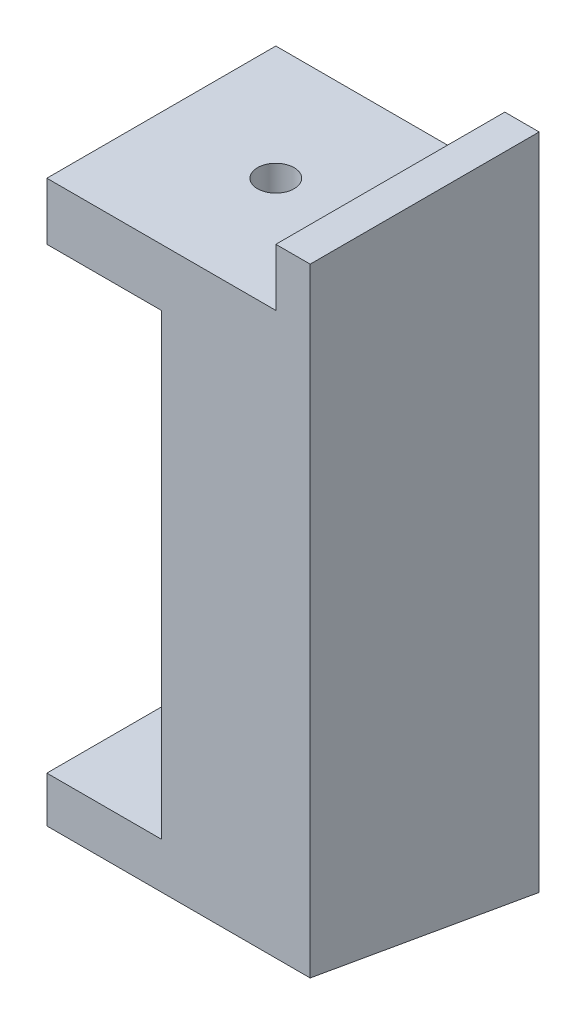
ISO-10303-21;
HEADER;
FILE_DESCRIPTION(('STEP AP214'),'2;1');
FILE_NAME('part.step','',(''),(''),'','','');
FILE_SCHEMA(('AUTOMOTIVE_DESIGN { 1 0 10303 214 1 1 1 1 }'));
ENDSEC;
DATA;
#1=APPLICATION_CONTEXT('core data for automotive mechanical design processes');
#2=APPLICATION_PROTOCOL_DEFINITION('international standard','automotive_design',2000,#1);
#3=PRODUCT_CONTEXT('',#1,'mechanical');
#4=PRODUCT('Part','Part','',(#3));
#5=PRODUCT_RELATED_PRODUCT_CATEGORY('part','',(#4));
#6=PRODUCT_DEFINITION_FORMATION('','',#4);
#7=PRODUCT_DEFINITION_CONTEXT('part definition',#1,'design');
#8=PRODUCT_DEFINITION('design','',#6,#7);
#9=PRODUCT_DEFINITION_SHAPE('','',#8);
#10=(LENGTH_UNIT() NAMED_UNIT(*) SI_UNIT(.MILLI.,.METRE.));
#11=(NAMED_UNIT(*) PLANE_ANGLE_UNIT() SI_UNIT($,.RADIAN.));
#12=(NAMED_UNIT(*) SI_UNIT($,.STERADIAN.) SOLID_ANGLE_UNIT());
#13=UNCERTAINTY_MEASURE_WITH_UNIT(LENGTH_MEASURE(1.E-05),#10,'distance_accuracy_value','');
#14=(GEOMETRIC_REPRESENTATION_CONTEXT(3) GLOBAL_UNCERTAINTY_ASSIGNED_CONTEXT((#13)) GLOBAL_UNIT_ASSIGNED_CONTEXT((#10,
#11,#12)) REPRESENTATION_CONTEXT('',''));
#15=CARTESIAN_POINT('',(0.,0.,0.));
#16=DIRECTION('',(0.,0.,1.));
#17=DIRECTION('',(1.,0.,0.));
#18=AXIS2_PLACEMENT_3D('',#15,#16,#17);
#19=CARTESIAN_POINT('',(-10.,-2.5,20.));
#20=DIRECTION('',(0.,1.,0.));
#21=DIRECTION('',(0.,0.,1.));
#22=AXIS2_PLACEMENT_3D('',#19,#20,#21);
#23=PLANE('',#22);
#24=CARTESIAN_POINT('',(0.,-2.5,10.));
#25=DIRECTION('',(0.,1.,0.));
#26=DIRECTION('',(0.,0.,1.));
#27=AXIS2_PLACEMENT_3D('',#24,#25,#26);
#28=CIRCLE('',#27,1.6);
#29=CARTESIAN_POINT('',(0.,-2.5,11.6));
#30=VERTEX_POINT('',#29);
#31=EDGE_CURVE('E231',#30,#30,#28,.T.);
#32=ORIENTED_EDGE('',*,*,#31,.T.);
#33=EDGE_LOOP('',(#32));
#34=FACE_BOUND('',#33,.T.);
#35=DIRECTION('',(-1.,0.,0.));
#36=VECTOR('',#35,1.);
#37=CARTESIAN_POINT('',(8.,-2.5,3.));
#38=LINE('',#37,#36);
#39=CARTESIAN_POINT('',(6.,-2.5,3.));
#40=VERTEX_POINT('',#39);
#41=CARTESIAN_POINT('',(0.,-2.5,3.));
#42=VERTEX_POINT('',#41);
#43=EDGE_CURVE('E215',#40,#42,#38,.T.);
#44=ORIENTED_EDGE('',*,*,#43,.F.);
#45=CARTESIAN_POINT('',(6.,-2.5,5.));
#46=DIRECTION('',(0.,1.,0.));
#47=DIRECTION('',(0.,0.,1.));
#48=AXIS2_PLACEMENT_3D('',#45,#46,#47);
#49=CIRCLE('',#48,2.);
#50=CARTESIAN_POINT('',(8.,-2.5,5.));
#51=VERTEX_POINT('',#50);
#52=EDGE_CURVE('E279',#40,#51,#49,.F.);
#53=ORIENTED_EDGE('',*,*,#52,.T.);
#54=DIRECTION('',(0.,0.,-1.));
#55=VECTOR('',#54,1.);
#56=CARTESIAN_POINT('',(8.,-2.5,3.));
#57=LINE('',#56,#55);
#58=CARTESIAN_POINT('',(8.,-2.5,15.));
#59=VERTEX_POINT('',#58);
#60=EDGE_CURVE('E213',#59,#51,#57,.T.);
#61=ORIENTED_EDGE('',*,*,#60,.F.);
#62=CARTESIAN_POINT('',(6.,-2.5,15.));
#63=DIRECTION('',(0.,1.,0.));
#64=DIRECTION('',(0.,0.,1.));
#65=AXIS2_PLACEMENT_3D('',#62,#63,#64);
#66=CIRCLE('',#65,2.);
#67=CARTESIAN_POINT('',(6.,-2.5,17.));
#68=VERTEX_POINT('',#67);
#69=EDGE_CURVE('E277',#59,#68,#66,.F.);
#70=ORIENTED_EDGE('',*,*,#69,.T.);
#71=DIRECTION('',(1.,0.,0.));
#72=VECTOR('',#71,1.);
#73=CARTESIAN_POINT('',(8.,-2.5,17.));
#74=LINE('',#73,#72);
#75=CARTESIAN_POINT('',(0.,-2.5,17.));
#76=VERTEX_POINT('',#75);
#77=EDGE_CURVE('E211',#76,#68,#74,.T.);
#78=ORIENTED_EDGE('',*,*,#77,.F.);
#79=DIRECTION('',(0.,0.,-1.));
#80=VECTOR('',#79,1.);
#81=CARTESIAN_POINT('',(0.,-2.5,20.));
#82=LINE('',#81,#80);
#83=CARTESIAN_POINT('',(0.,-2.5,20.));
#84=VERTEX_POINT('',#83);
#85=EDGE_CURVE('E189',#84,#76,#82,.T.);
#86=ORIENTED_EDGE('',*,*,#85,.F.);
#87=DIRECTION('',(1.,0.,0.));
#88=VECTOR('',#87,1.);
#89=CARTESIAN_POINT('',(10.,-2.5,20.));
#90=LINE('',#89,#88);
#91=CARTESIAN_POINT('',(-10.,-2.5,20.));
#92=VERTEX_POINT('',#91);
#93=EDGE_CURVE('E232',#92,#84,#90,.T.);
#94=ORIENTED_EDGE('',*,*,#93,.F.);
#95=DIRECTION('',(0.,0.,-1.));
#96=VECTOR('',#95,1.);
#97=CARTESIAN_POINT('',(-10.,-2.5,20.));
#98=LINE('',#97,#96);
#99=CARTESIAN_POINT('',(-10.,-2.5,0.));
#100=VERTEX_POINT('',#99);
#101=EDGE_CURVE('E246',#92,#100,#98,.T.);
#102=ORIENTED_EDGE('',*,*,#101,.T.);
#103=DIRECTION('',(1.,0.,0.));
#104=VECTOR('',#103,1.);
#105=CARTESIAN_POINT('',(-10.,-2.5,0.));
#106=LINE('',#105,#104);
#107=CARTESIAN_POINT('',(0.,-2.5,0.));
#108=VERTEX_POINT('',#107);
#109=EDGE_CURVE('E235',#100,#108,#106,.T.);
#110=ORIENTED_EDGE('',*,*,#109,.T.);
#111=DIRECTION('',(0.,0.,-1.));
#112=VECTOR('',#111,1.);
#113=CARTESIAN_POINT('',(0.,-2.5,0.));
#114=LINE('',#113,#112);
#115=EDGE_CURVE('E197',#42,#108,#114,.T.);
#116=ORIENTED_EDGE('',*,*,#115,.F.);
#117=EDGE_LOOP('',(#44,#53,#61,#70,#78,#86,#94,#102,#110,#116));
#118=FACE_BOUND('',#117,.T.);
#119=ADVANCED_FACE('F33',(#34,#118),#23,.F.);
#120=CARTESIAN_POINT('',(13.,-2.5,20.));
#121=DIRECTION('',(-1.,0.,0.));
#122=DIRECTION('',(0.,-1.,0.));
#123=AXIS2_PLACEMENT_3D('',#120,#121,#122);
#124=PLANE('',#123);
#125=DIRECTION('',(0.,1.,0.));
#126=VECTOR('',#125,1.);
#127=CARTESIAN_POINT('',(13.,-2.5,0.));
#128=LINE('',#127,#126);
#129=CARTESIAN_POINT('',(13.,-50.0265396141692,0.));
#130=VERTEX_POINT('',#129);
#131=CARTESIAN_POINT('',(13.,7.5,0.));
#132=VERTEX_POINT('',#131);
#133=EDGE_CURVE('E247',#130,#132,#128,.T.);
#134=ORIENTED_EDGE('',*,*,#133,.T.);
#135=DIRECTION('',(0.,0.,-1.));
#136=VECTOR('',#135,1.);
#137=CARTESIAN_POINT('',(13.,7.5,20.));
#138=LINE('',#137,#136);
#139=CARTESIAN_POINT('',(13.,7.5,20.));
#140=VERTEX_POINT('',#139);
#141=EDGE_CURVE('E269',#140,#132,#138,.T.);
#142=ORIENTED_EDGE('',*,*,#141,.F.);
#143=DIRECTION('',(0.,1.,0.));
#144=VECTOR('',#143,1.);
#145=CARTESIAN_POINT('',(13.,-2.5,20.));
#146=LINE('',#145,#144);
#147=CARTESIAN_POINT('',(13.,-46.5,20.));
#148=VERTEX_POINT('',#147);
#149=EDGE_CURVE('E234',#148,#140,#146,.T.);
#150=ORIENTED_EDGE('',*,*,#149,.F.);
#151=DIRECTION('',(0.,-0.173648177666926,-0.984807753012209));
#152=VECTOR('',#151,1.);
#153=CARTESIAN_POINT('',(13.,-46.5,20.));
#154=LINE('',#153,#152);
#155=EDGE_CURVE('E179',#148,#130,#154,.T.);
#156=ORIENTED_EDGE('',*,*,#155,.T.);
#157=EDGE_LOOP('',(#134,#142,#150,#156));
#158=FACE_BOUND('',#157,.T.);
#159=ADVANCED_FACE('F310',(#158),#124,.F.);
#160=CARTESIAN_POINT('',(10.,7.5,20.));
#161=DIRECTION('',(0.,-1.,0.));
#162=DIRECTION('',(0.,0.,-1.));
#163=AXIS2_PLACEMENT_3D('',#160,#161,#162);
#164=PLANE('',#163);
#165=DIRECTION('',(-1.,0.,0.));
#166=VECTOR('',#165,1.);
#167=CARTESIAN_POINT('',(10.,7.5,0.));
#168=LINE('',#167,#166);
#169=CARTESIAN_POINT('',(10.,7.5,0.));
#170=VERTEX_POINT('',#169);
#171=EDGE_CURVE('E249',#132,#170,#168,.T.);
#172=ORIENTED_EDGE('',*,*,#171,.T.);
#173=DIRECTION('',(0.,0.,-1.));
#174=VECTOR('',#173,1.);
#175=CARTESIAN_POINT('',(10.,7.5,20.));
#176=LINE('',#175,#174);
#177=CARTESIAN_POINT('',(10.,7.5,20.));
#178=VERTEX_POINT('',#177);
#179=EDGE_CURVE('E266',#178,#170,#176,.T.);
#180=ORIENTED_EDGE('',*,*,#179,.F.);
#181=DIRECTION('',(-1.,0.,0.));
#182=VECTOR('',#181,1.);
#183=CARTESIAN_POINT('',(10.,7.5,20.));
#184=LINE('',#183,#182);
#185=EDGE_CURVE('E237',#140,#178,#184,.T.);
#186=ORIENTED_EDGE('',*,*,#185,.F.);
#187=ORIENTED_EDGE('',*,*,#141,.T.);
#188=EDGE_LOOP('',(#172,#180,#186,#187));
#189=FACE_BOUND('',#188,.T.);
#190=ADVANCED_FACE('F312',(#189),#164,.F.);
#191=CARTESIAN_POINT('',(10.,2.5,20.));
#192=DIRECTION('',(1.,0.,0.));
#193=DIRECTION('',(0.,1.,0.));
#194=AXIS2_PLACEMENT_3D('',#191,#192,#193);
#195=PLANE('',#194);
#196=DIRECTION('',(0.,-1.,0.));
#197=VECTOR('',#196,1.);
#198=CARTESIAN_POINT('',(10.,2.5,0.));
#199=LINE('',#198,#197);
#200=CARTESIAN_POINT('',(10.,2.5,0.));
#201=VERTEX_POINT('',#200);
#202=EDGE_CURVE('E251',#170,#201,#199,.T.);
#203=ORIENTED_EDGE('',*,*,#202,.T.);
#204=DIRECTION('',(0.,0.,-1.));
#205=VECTOR('',#204,1.);
#206=CARTESIAN_POINT('',(10.,2.5,20.));
#207=LINE('',#206,#205);
#208=CARTESIAN_POINT('',(10.,2.5,20.));
#209=VERTEX_POINT('',#208);
#210=EDGE_CURVE('E263',#209,#201,#207,.T.);
#211=ORIENTED_EDGE('',*,*,#210,.F.);
#212=DIRECTION('',(0.,-1.,0.));
#213=VECTOR('',#212,1.);
#214=CARTESIAN_POINT('',(10.,2.5,20.));
#215=LINE('',#214,#213);
#216=EDGE_CURVE('E239',#178,#209,#215,.T.);
#217=ORIENTED_EDGE('',*,*,#216,.F.);
#218=ORIENTED_EDGE('',*,*,#179,.T.);
#219=EDGE_LOOP('',(#203,#211,#217,#218));
#220=FACE_BOUND('',#219,.T.);
#221=ADVANCED_FACE('F317',(#220),#195,.F.);
#222=CARTESIAN_POINT('',(-10.,2.5,20.));
#223=DIRECTION('',(0.,-1.,0.));
#224=DIRECTION('',(0.,0.,-1.));
#225=AXIS2_PLACEMENT_3D('',#222,#223,#224);
#226=PLANE('',#225);
#227=CARTESIAN_POINT('',(0.,2.5,10.));
#228=DIRECTION('',(0.,1.,0.));
#229=DIRECTION('',(0.,0.,1.));
#230=AXIS2_PLACEMENT_3D('',#227,#228,#229);
#231=CIRCLE('',#230,1.6);
#232=CARTESIAN_POINT('',(0.,2.5,11.6));
#233=VERTEX_POINT('',#232);
#234=EDGE_CURVE('E228',#233,#233,#231,.T.);
#235=ORIENTED_EDGE('',*,*,#234,.F.);
#236=EDGE_LOOP('',(#235));
#237=FACE_BOUND('',#236,.T.);
#238=DIRECTION('',(-1.,0.,0.));
#239=VECTOR('',#238,1.);
#240=CARTESIAN_POINT('',(-10.,2.5,0.));
#241=LINE('',#240,#239);
#242=CARTESIAN_POINT('',(-10.,2.5,0.));
#243=VERTEX_POINT('',#242);
#244=EDGE_CURVE('E253',#201,#243,#241,.T.);
#245=ORIENTED_EDGE('',*,*,#244,.T.);
#246=DIRECTION('',(0.,0.,-1.));
#247=VECTOR('',#246,1.);
#248=CARTESIAN_POINT('',(-10.,2.5,20.));
#249=LINE('',#248,#247);
#250=CARTESIAN_POINT('',(-10.,2.5,20.));
#251=VERTEX_POINT('',#250);
#252=EDGE_CURVE('E260',#251,#243,#249,.T.);
#253=ORIENTED_EDGE('',*,*,#252,.F.);
#254=DIRECTION('',(-1.,0.,0.));
#255=VECTOR('',#254,1.);
#256=CARTESIAN_POINT('',(-10.,2.5,20.));
#257=LINE('',#256,#255);
#258=EDGE_CURVE('E241',#209,#251,#257,.T.);
#259=ORIENTED_EDGE('',*,*,#258,.F.);
#260=ORIENTED_EDGE('',*,*,#210,.T.);
#261=EDGE_LOOP('',(#245,#253,#259,#260));
#262=FACE_BOUND('',#261,.T.);
#263=ADVANCED_FACE('F323',(#237,#262),#226,.F.);
#264=CARTESIAN_POINT('',(-10.,2.5,20.));
#265=DIRECTION('',(1.,0.,0.));
#266=DIRECTION('',(0.,0.,-1.));
#267=AXIS2_PLACEMENT_3D('',#264,#265,#266);
#268=PLANE('',#267);
#269=DIRECTION('',(0.,-1.,0.));
#270=VECTOR('',#269,1.);
#271=CARTESIAN_POINT('',(-10.,2.5,0.));
#272=LINE('',#271,#270);
#273=EDGE_CURVE('E255',#243,#100,#272,.T.);
#274=ORIENTED_EDGE('',*,*,#273,.T.);
#275=ORIENTED_EDGE('',*,*,#101,.F.);
#276=DIRECTION('',(0.,-1.,0.));
#277=VECTOR('',#276,1.);
#278=CARTESIAN_POINT('',(-10.,2.5,20.));
#279=LINE('',#278,#277);
#280=EDGE_CURVE('E243',#251,#92,#279,.T.);
#281=ORIENTED_EDGE('',*,*,#280,.F.);
#282=ORIENTED_EDGE('',*,*,#252,.T.);
#283=EDGE_LOOP('',(#274,#275,#281,#282));
#284=FACE_BOUND('',#283,.T.);
#285=ADVANCED_FACE('F327',(#284),#268,.F.);
#286=CARTESIAN_POINT('',(0.,0.,20.));
#287=DIRECTION('',(0.,0.,1.));
#288=DIRECTION('',(1.,0.,0.));
#289=AXIS2_PLACEMENT_3D('',#286,#287,#288);
#290=PLANE('',#289);
#291=ORIENTED_EDGE('',*,*,#93,.T.);
#292=DIRECTION('',(0.,1.,0.));
#293=VECTOR('',#292,1.);
#294=CARTESIAN_POINT('',(0.,-42.5,20.));
#295=LINE('',#294,#293);
#296=CARTESIAN_POINT('',(0.,-42.5,20.));
#297=VERTEX_POINT('',#296);
#298=EDGE_CURVE('E157',#297,#84,#295,.T.);
#299=ORIENTED_EDGE('',*,*,#298,.F.);
#300=DIRECTION('',(1.,0.,0.));
#301=VECTOR('',#300,1.);
#302=CARTESIAN_POINT('',(-9.99999999999998,-42.5,20.));
#303=LINE('',#302,#301);
#304=CARTESIAN_POINT('',(-9.99999999999998,-42.5,20.));
#305=VERTEX_POINT('',#304);
#306=EDGE_CURVE('E150',#305,#297,#303,.T.);
#307=ORIENTED_EDGE('',*,*,#306,.F.);
#308=DIRECTION('',(0.,-1.,0.));
#309=VECTOR('',#308,1.);
#310=CARTESIAN_POINT('',(-9.99999999999998,-42.5,20.));
#311=LINE('',#310,#309);
#312=CARTESIAN_POINT('',(-9.99999999999998,-46.5,20.));
#313=VERTEX_POINT('',#312);
#314=EDGE_CURVE('E155',#305,#313,#311,.T.);
#315=ORIENTED_EDGE('',*,*,#314,.T.);
#316=DIRECTION('',(1.,0.,0.));
#317=VECTOR('',#316,1.);
#318=CARTESIAN_POINT('',(-9.99999999999998,-46.5,20.));
#319=LINE('',#318,#317);
#320=EDGE_CURVE('E162',#313,#148,#319,.T.);
#321=ORIENTED_EDGE('',*,*,#320,.T.);
#322=ORIENTED_EDGE('',*,*,#149,.T.);
#323=ORIENTED_EDGE('',*,*,#185,.T.);
#324=ORIENTED_EDGE('',*,*,#216,.T.);
#325=ORIENTED_EDGE('',*,*,#258,.T.);
#326=ORIENTED_EDGE('',*,*,#280,.T.);
#327=EDGE_LOOP('',(#291,#299,#307,#315,#321,#322,#323,#324,#325,#326));
#328=FACE_BOUND('',#327,.T.);
#329=ADVANCED_FACE('F153',(#328),#290,.T.);
#330=CARTESIAN_POINT('',(0.,0.,0.));
#331=DIRECTION('',(0.,0.,1.));
#332=DIRECTION('',(1.,0.,0.));
#333=AXIS2_PLACEMENT_3D('',#330,#331,#332);
#334=PLANE('',#333);
#335=ORIENTED_EDGE('',*,*,#133,.F.);
#336=DIRECTION('',(1.,0.,0.));
#337=VECTOR('',#336,1.);
#338=CARTESIAN_POINT('',(-9.99999999999998,-50.0265396141692,0.));
#339=LINE('',#338,#337);
#340=CARTESIAN_POINT('',(-9.99999999999998,-50.0265396141692,0.));
#341=VERTEX_POINT('',#340);
#342=EDGE_CURVE('E190',#341,#130,#339,.T.);
#343=ORIENTED_EDGE('',*,*,#342,.F.);
#344=DIRECTION('',(0.,1.,0.));
#345=VECTOR('',#344,1.);
#346=CARTESIAN_POINT('',(-9.99999999999998,-50.0265396141692,0.));
#347=LINE('',#346,#345);
#348=CARTESIAN_POINT('',(-9.99999999999998,-42.5,0.));
#349=VERTEX_POINT('',#348);
#350=EDGE_CURVE('E163',#341,#349,#347,.T.);
#351=ORIENTED_EDGE('',*,*,#350,.T.);
#352=DIRECTION('',(1.,0.,0.));
#353=VECTOR('',#352,1.);
#354=CARTESIAN_POINT('',(-9.99999999999998,-42.5,0.));
#355=LINE('',#354,#353);
#356=CARTESIAN_POINT('',(0.,-42.5,0.));
#357=VERTEX_POINT('',#356);
#358=EDGE_CURVE('E178',#349,#357,#355,.T.);
#359=ORIENTED_EDGE('',*,*,#358,.T.);
#360=DIRECTION('',(0.,1.,0.));
#361=VECTOR('',#360,1.);
#362=CARTESIAN_POINT('',(0.,-42.5,0.));
#363=LINE('',#362,#361);
#364=EDGE_CURVE('E208',#357,#108,#363,.T.);
#365=ORIENTED_EDGE('',*,*,#364,.T.);
#366=ORIENTED_EDGE('',*,*,#109,.F.);
#367=ORIENTED_EDGE('',*,*,#273,.F.);
#368=ORIENTED_EDGE('',*,*,#244,.F.);
#369=ORIENTED_EDGE('',*,*,#202,.F.);
#370=ORIENTED_EDGE('',*,*,#171,.F.);
#371=EDGE_LOOP('',(#335,#343,#351,#359,#365,#366,#367,#368,#369,#370));
#372=FACE_BOUND('',#371,.T.);
#373=ADVANCED_FACE('F301',(#372),#334,.F.);
#374=CARTESIAN_POINT('',(0.,-17.5,10.));
#375=DIRECTION('',(0.,1.,0.));
#376=DIRECTION('',(0.,0.,1.));
#377=AXIS2_PLACEMENT_3D('',#374,#375,#376);
#378=CYLINDRICAL_SURFACE('',#377,1.6);
#379=ORIENTED_EDGE('',*,*,#234,.T.);
#380=EDGE_LOOP('',(#379));
#381=FACE_BOUND('',#380,.T.);
#382=ORIENTED_EDGE('',*,*,#31,.F.);
#383=EDGE_LOOP('',(#382));
#384=FACE_BOUND('',#383,.T.);
#385=ADVANCED_FACE('F437',(#381,#384),#378,.F.);
#386=CARTESIAN_POINT('',(0.,-42.5,20.));
#387=DIRECTION('',(1.,0.,0.));
#388=DIRECTION('',(0.,0.,-1.));
#389=AXIS2_PLACEMENT_3D('',#386,#387,#388);
#390=PLANE('',#389);
#391=ORIENTED_EDGE('',*,*,#85,.T.);
#392=DIRECTION('',(0.,1.,0.));
#393=VECTOR('',#392,1.);
#394=CARTESIAN_POINT('',(0.,-42.5,17.));
#395=LINE('',#394,#393);
#396=CARTESIAN_POINT('',(0.,-42.5,17.));
#397=VERTEX_POINT('',#396);
#398=EDGE_CURVE('E224',#397,#76,#395,.T.);
#399=ORIENTED_EDGE('',*,*,#398,.F.);
#400=DIRECTION('',(0.,0.,-1.));
#401=VECTOR('',#400,1.);
#402=CARTESIAN_POINT('',(0.,-42.5,20.));
#403=LINE('',#402,#401);
#404=EDGE_CURVE('E194',#297,#397,#403,.T.);
#405=ORIENTED_EDGE('',*,*,#404,.F.);
#406=ORIENTED_EDGE('',*,*,#298,.T.);
#407=EDGE_LOOP('',(#391,#399,#405,#406));
#408=FACE_BOUND('',#407,.T.);
#409=ADVANCED_FACE('F329',(#408),#390,.F.);
#410=CARTESIAN_POINT('',(8.,-42.5,17.));
#411=DIRECTION('',(0.,0.,1.));
#412=DIRECTION('',(1.,0.,0.));
#413=AXIS2_PLACEMENT_3D('',#410,#411,#412);
#414=PLANE('',#413);
#415=ORIENTED_EDGE('',*,*,#77,.T.);
#416=DIRECTION('',(0.,1.,0.));
#417=VECTOR('',#416,1.);
#418=CARTESIAN_POINT('',(6.,-42.5,17.));
#419=LINE('',#418,#417);
#420=CARTESIAN_POINT('',(6.,-42.5,17.));
#421=VERTEX_POINT('',#420);
#422=EDGE_CURVE('E49',#68,#421,#419,.F.);
#423=ORIENTED_EDGE('',*,*,#422,.T.);
#424=DIRECTION('',(1.,0.,0.));
#425=VECTOR('',#424,1.);
#426=CARTESIAN_POINT('',(8.,-42.5,17.));
#427=LINE('',#426,#425);
#428=EDGE_CURVE('E196',#397,#421,#427,.T.);
#429=ORIENTED_EDGE('',*,*,#428,.F.);
#430=ORIENTED_EDGE('',*,*,#398,.T.);
#431=EDGE_LOOP('',(#415,#423,#429,#430));
#432=FACE_BOUND('',#431,.T.);
#433=ADVANCED_FACE('F330',(#432),#414,.F.);
#434=CARTESIAN_POINT('',(8.,-42.5,3.));
#435=DIRECTION('',(1.,0.,0.));
#436=DIRECTION('',(0.,0.,-1.));
#437=AXIS2_PLACEMENT_3D('',#434,#435,#436);
#438=PLANE('',#437);
#439=ORIENTED_EDGE('',*,*,#60,.T.);
#440=DIRECTION('',(0.,1.,0.));
#441=VECTOR('',#440,1.);
#442=CARTESIAN_POINT('',(8.,-42.5,5.));
#443=LINE('',#442,#441);
#444=CARTESIAN_POINT('',(8.,-42.5,5.));
#445=VERTEX_POINT('',#444);
#446=EDGE_CURVE('E57',#51,#445,#443,.F.);
#447=ORIENTED_EDGE('',*,*,#446,.T.);
#448=DIRECTION('',(0.,0.,-1.));
#449=VECTOR('',#448,1.);
#450=CARTESIAN_POINT('',(8.,-42.5,3.));
#451=LINE('',#450,#449);
#452=CARTESIAN_POINT('',(8.,-42.5,15.));
#453=VERTEX_POINT('',#452);
#454=EDGE_CURVE('E200',#453,#445,#451,.T.);
#455=ORIENTED_EDGE('',*,*,#454,.F.);
#456=DIRECTION('',(0.,1.,0.));
#457=VECTOR('',#456,1.);
#458=CARTESIAN_POINT('',(8.,-2.5,15.));
#459=LINE('',#458,#457);
#460=EDGE_CURVE('E281',#453,#59,#459,.T.);
#461=ORIENTED_EDGE('',*,*,#460,.T.);
#462=EDGE_LOOP('',(#439,#447,#455,#461));
#463=FACE_BOUND('',#462,.T.);
#464=ADVANCED_FACE('F333',(#463),#438,.F.);
#465=CARTESIAN_POINT('',(8.,-42.5,3.));
#466=DIRECTION('',(0.,0.,-1.));
#467=DIRECTION('',(-1.,0.,0.));
#468=AXIS2_PLACEMENT_3D('',#465,#466,#467);
#469=PLANE('',#468);
#470=DIRECTION('',(-1.,0.,0.));
#471=VECTOR('',#470,1.);
#472=CARTESIAN_POINT('',(8.,-42.5,3.));
#473=LINE('',#472,#471);
#474=CARTESIAN_POINT('',(6.,-42.5,3.));
#475=VERTEX_POINT('',#474);
#476=CARTESIAN_POINT('',(0.,-42.5,3.));
#477=VERTEX_POINT('',#476);
#478=EDGE_CURVE('E203',#475,#477,#473,.T.);
#479=ORIENTED_EDGE('',*,*,#478,.F.);
#480=DIRECTION('',(0.,1.,0.));
#481=VECTOR('',#480,1.);
#482=CARTESIAN_POINT('',(6.,-2.5,3.));
#483=LINE('',#482,#481);
#484=EDGE_CURVE('E272',#475,#40,#483,.T.);
#485=ORIENTED_EDGE('',*,*,#484,.T.);
#486=ORIENTED_EDGE('',*,*,#43,.T.);
#487=DIRECTION('',(0.,1.,0.));
#488=VECTOR('',#487,1.);
#489=CARTESIAN_POINT('',(0.,-42.5,3.));
#490=LINE('',#489,#488);
#491=EDGE_CURVE('E221',#477,#42,#490,.T.);
#492=ORIENTED_EDGE('',*,*,#491,.F.);
#493=EDGE_LOOP('',(#479,#485,#486,#492));
#494=FACE_BOUND('',#493,.T.);
#495=ADVANCED_FACE('F292',(#494),#469,.F.);
#496=CARTESIAN_POINT('',(0.,-42.5,0.));
#497=DIRECTION('',(1.,0.,0.));
#498=DIRECTION('',(0.,0.,-1.));
#499=AXIS2_PLACEMENT_3D('',#496,#497,#498);
#500=PLANE('',#499);
#501=ORIENTED_EDGE('',*,*,#115,.T.);
#502=ORIENTED_EDGE('',*,*,#364,.F.);
#503=DIRECTION('',(0.,0.,-1.));
#504=VECTOR('',#503,1.);
#505=CARTESIAN_POINT('',(0.,-42.5,0.));
#506=LINE('',#505,#504);
#507=EDGE_CURVE('E206',#477,#357,#506,.T.);
#508=ORIENTED_EDGE('',*,*,#507,.F.);
#509=ORIENTED_EDGE('',*,*,#491,.T.);
#510=EDGE_LOOP('',(#501,#502,#508,#509));
#511=FACE_BOUND('',#510,.T.);
#512=ADVANCED_FACE('F299',(#511),#500,.F.);
#513=CARTESIAN_POINT('',(6.,-42.5,5.));
#514=DIRECTION('',(0.,-1.,0.));
#515=DIRECTION('',(0.,0.,-1.));
#516=AXIS2_PLACEMENT_3D('',#513,#514,#515);
#517=CYLINDRICAL_SURFACE('',#516,2.);
#518=CARTESIAN_POINT('',(6.,-42.5,5.));
#519=DIRECTION('',(0.,-1.,0.));
#520=DIRECTION('',(0.,0.,-1.));
#521=AXIS2_PLACEMENT_3D('',#518,#519,#520);
#522=CIRCLE('',#521,2.);
#523=EDGE_CURVE('E42',#445,#475,#522,.F.);
#524=ORIENTED_EDGE('',*,*,#523,.F.);
#525=ORIENTED_EDGE('',*,*,#446,.F.);
#526=ORIENTED_EDGE('',*,*,#52,.F.);
#527=ORIENTED_EDGE('',*,*,#484,.F.);
#528=EDGE_LOOP('',(#524,#525,#526,#527));
#529=FACE_BOUND('',#528,.T.);
#530=ADVANCED_FACE('F289',(#529),#517,.F.);
#531=CARTESIAN_POINT('',(6.,-42.5,15.));
#532=DIRECTION('',(0.,-1.,0.));
#533=DIRECTION('',(0.,0.,-1.));
#534=AXIS2_PLACEMENT_3D('',#531,#532,#533);
#535=CYLINDRICAL_SURFACE('',#534,2.);
#536=CARTESIAN_POINT('',(6.,-42.5,15.));
#537=DIRECTION('',(0.,-1.,0.));
#538=DIRECTION('',(0.,0.,-1.));
#539=AXIS2_PLACEMENT_3D('',#536,#537,#538);
#540=CIRCLE('',#539,2.);
#541=EDGE_CURVE('E11',#421,#453,#540,.F.);
#542=ORIENTED_EDGE('',*,*,#541,.F.);
#543=ORIENTED_EDGE('',*,*,#422,.F.);
#544=ORIENTED_EDGE('',*,*,#69,.F.);
#545=ORIENTED_EDGE('',*,*,#460,.F.);
#546=EDGE_LOOP('',(#542,#543,#544,#545));
#547=FACE_BOUND('',#546,.T.);
#548=ADVANCED_FACE('F35',(#547),#535,.F.);
#549=CARTESIAN_POINT('',(-9.99999999999998,-42.5,20.));
#550=DIRECTION('',(0.,1.,0.));
#551=DIRECTION('',(-1.,0.,0.));
#552=AXIS2_PLACEMENT_3D('',#549,#550,#551);
#553=PLANE('',#552);
#554=CARTESIAN_POINT('',(-0.999999999999984,-42.5,10.));
#555=DIRECTION('',(0.,1.,0.));
#556=DIRECTION('',(-1.,0.,0.));
#557=AXIS2_PLACEMENT_3D('',#554,#555,#556);
#558=CIRCLE('',#557,3.2);
#559=CARTESIAN_POINT('',(-4.19999999999999,-42.5,10.));
#560=VERTEX_POINT('',#559);
#561=EDGE_CURVE('E184',#560,#560,#558,.T.);
#562=ORIENTED_EDGE('',*,*,#561,.F.);
#563=EDGE_LOOP('',(#562));
#564=FACE_BOUND('',#563,.T.);
#565=ORIENTED_EDGE('',*,*,#306,.T.);
#566=ORIENTED_EDGE('',*,*,#404,.T.);
#567=ORIENTED_EDGE('',*,*,#428,.T.);
#568=ORIENTED_EDGE('',*,*,#541,.T.);
#569=ORIENTED_EDGE('',*,*,#454,.T.);
#570=ORIENTED_EDGE('',*,*,#523,.T.);
#571=ORIENTED_EDGE('',*,*,#478,.T.);
#572=ORIENTED_EDGE('',*,*,#507,.T.);
#573=ORIENTED_EDGE('',*,*,#358,.F.);
#574=DIRECTION('',(0.,0.,1.));
#575=VECTOR('',#574,1.);
#576=CARTESIAN_POINT('',(-9.99999999999998,-42.5,20.));
#577=LINE('',#576,#575);
#578=EDGE_CURVE('E170',#349,#305,#577,.T.);
#579=ORIENTED_EDGE('',*,*,#578,.T.);
#580=EDGE_LOOP('',(#565,#566,#567,#568,#569,#570,#571,#572,#573,#579));
#581=FACE_BOUND('',#580,.T.);
#582=ADVANCED_FACE('F175',(#564,#581),#553,.T.);
#583=CARTESIAN_POINT('',(-9.99999999999998,-46.5,20.));
#584=DIRECTION('',(0.,-0.984807753012209,0.173648177666926));
#585=DIRECTION('',(0.,-0.173648177666926,-0.984807753012209));
#586=AXIS2_PLACEMENT_3D('',#583,#584,#585);
#587=PLANE('',#586);
#588=CARTESIAN_POINT('',(-0.999999999999982,-48.2632698070846,10.));
#589=DIRECTION('',(0.,-0.984807753012209,0.173648177666926));
#590=DIRECTION('',(0.,0.173648177666926,0.984807753012209));
#591=AXIS2_PLACEMENT_3D('',#588,#589,#590);
#592=ELLIPSE('',#591,3.24936515803438,3.2);
#593=CARTESIAN_POINT('',(-0.999999999999983,-47.6990234688176,13.2));
#594=VERTEX_POINT('',#593);
#595=EDGE_CURVE('E37',#594,#594,#592,.T.);
#596=ORIENTED_EDGE('',*,*,#595,.F.);
#597=EDGE_LOOP('',(#596));
#598=FACE_BOUND('',#597,.T.);
#599=ORIENTED_EDGE('',*,*,#155,.F.);
#600=ORIENTED_EDGE('',*,*,#320,.F.);
#601=DIRECTION('',(0.,-0.173648177666926,-0.984807753012209));
#602=VECTOR('',#601,1.);
#603=CARTESIAN_POINT('',(-9.99999999999998,-46.5,20.));
#604=LINE('',#603,#602);
#605=EDGE_CURVE('E173',#313,#341,#604,.T.);
#606=ORIENTED_EDGE('',*,*,#605,.T.);
#607=ORIENTED_EDGE('',*,*,#342,.T.);
#608=EDGE_LOOP('',(#599,#600,#606,#607));
#609=FACE_BOUND('',#608,.T.);
#610=ADVANCED_FACE('F305',(#598,#609),#587,.T.);
#611=CARTESIAN_POINT('',(-9.99999999999999,0.,0.));
#612=DIRECTION('',(1.,0.,0.));
#613=DIRECTION('',(0.,1.,0.));
#614=AXIS2_PLACEMENT_3D('',#611,#612,#613);
#615=PLANE('',#614);
#616=ORIENTED_EDGE('',*,*,#578,.F.);
#617=ORIENTED_EDGE('',*,*,#350,.F.);
#618=ORIENTED_EDGE('',*,*,#605,.F.);
#619=ORIENTED_EDGE('',*,*,#314,.F.);
#620=EDGE_LOOP('',(#616,#617,#618,#619));
#621=FACE_BOUND('',#620,.T.);
#622=ADVANCED_FACE('F168',(#621),#615,.F.);
#623=CARTESIAN_POINT('',(-0.99999999999998,-55.5,10.));
#624=DIRECTION('',(0.,1.,0.));
#625=DIRECTION('',(-1.,0.,0.));
#626=AXIS2_PLACEMENT_3D('',#623,#624,#625);
#627=CYLINDRICAL_SURFACE('',#626,3.2);
#628=ORIENTED_EDGE('',*,*,#595,.T.);
#629=EDGE_LOOP('',(#628));
#630=FACE_BOUND('',#629,.T.);
#631=ORIENTED_EDGE('',*,*,#561,.T.);
#632=EDGE_LOOP('',(#631));
#633=FACE_BOUND('',#632,.T.);
#634=ADVANCED_FACE('F377',(#630,#633),#627,.F.);
#635=CLOSED_SHELL('',(#119,#159,#190,#221,#263,#285,#329,#373,#385,#409,#433,#464,#495,#512,
#530,#548,#582,#610,#622,#634));
#636=MANIFOLD_SOLID_BREP('B2',#635);
#637=ADVANCED_BREP_SHAPE_REPRESENTATION('',(#18,#636),#14);
#638=SHAPE_DEFINITION_REPRESENTATION(#9,#637);
ENDSEC;
END-ISO-10303-21;
